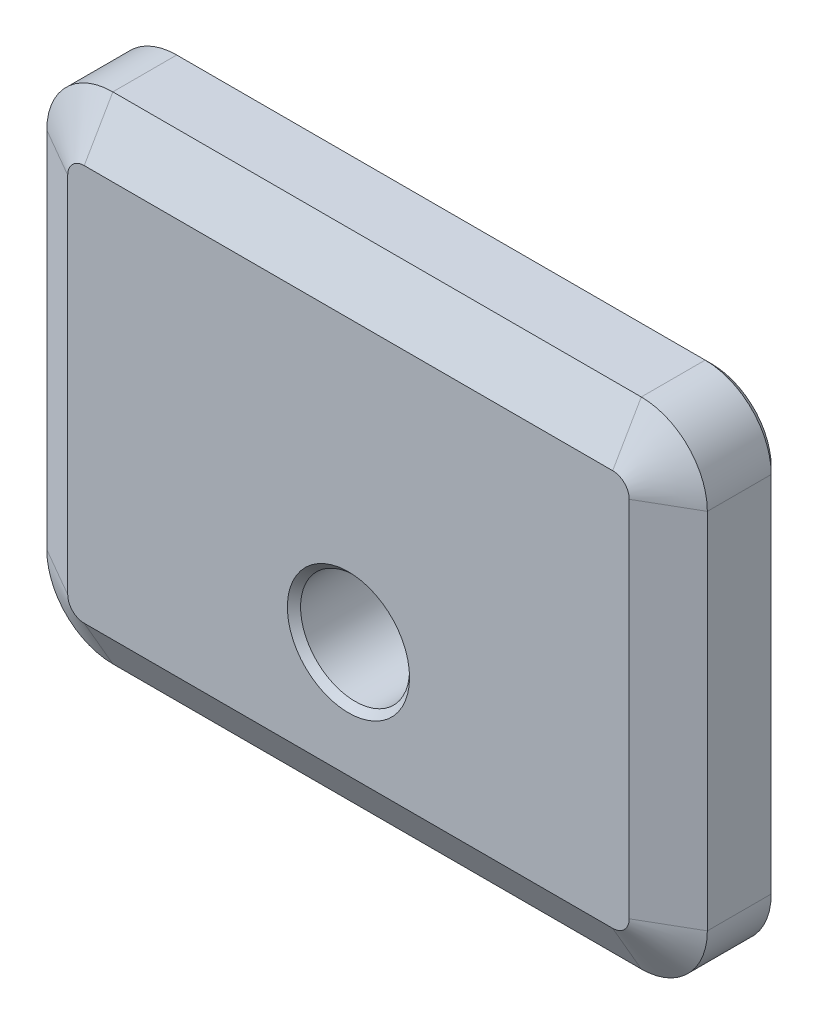
ISO-10303-21;
HEADER;
FILE_DESCRIPTION(('STEP AP214'),'2;1');
FILE_NAME('part.step','',(''),(''),'','','');
FILE_SCHEMA(('AUTOMOTIVE_DESIGN { 1 0 10303 214 1 1 1 1 }'));
ENDSEC;
DATA;
#1=APPLICATION_CONTEXT('core data for automotive mechanical design processes');
#2=APPLICATION_PROTOCOL_DEFINITION('international standard','automotive_design',2000,#1);
#3=PRODUCT_CONTEXT('',#1,'mechanical');
#4=PRODUCT('Part','Part','',(#3));
#5=PRODUCT_RELATED_PRODUCT_CATEGORY('part','',(#4));
#6=PRODUCT_DEFINITION_FORMATION('','',#4);
#7=PRODUCT_DEFINITION_CONTEXT('part definition',#1,'design');
#8=PRODUCT_DEFINITION('design','',#6,#7);
#9=PRODUCT_DEFINITION_SHAPE('','',#8);
#10=(LENGTH_UNIT() NAMED_UNIT(*) SI_UNIT(.MILLI.,.METRE.));
#11=(NAMED_UNIT(*) PLANE_ANGLE_UNIT() SI_UNIT($,.RADIAN.));
#12=(NAMED_UNIT(*) SI_UNIT($,.STERADIAN.) SOLID_ANGLE_UNIT());
#13=UNCERTAINTY_MEASURE_WITH_UNIT(LENGTH_MEASURE(1.E-05),#10,'distance_accuracy_value','');
#14=(GEOMETRIC_REPRESENTATION_CONTEXT(3) GLOBAL_UNCERTAINTY_ASSIGNED_CONTEXT((#13)) GLOBAL_UNIT_ASSIGNED_CONTEXT((#10,
#11,#12)) REPRESENTATION_CONTEXT('',''));
#15=CARTESIAN_POINT('',(0.,0.,0.));
#16=DIRECTION('',(0.,0.,1.));
#17=DIRECTION('',(1.,0.,0.));
#18=AXIS2_PLACEMENT_3D('',#15,#16,#17);
#19=CARTESIAN_POINT('',(0.,0.,3.));
#20=DIRECTION('',(0.,0.,1.));
#21=DIRECTION('',(1.,0.,0.));
#22=AXIS2_PLACEMENT_3D('',#19,#20,#21);
#23=PLANE('',#22);
#24=CARTESIAN_POINT('',(0.,0.,3.));
#25=DIRECTION('',(0.,0.,1.));
#26=DIRECTION('',(1.,0.,0.));
#27=AXIS2_PLACEMENT_3D('',#24,#25,#26);
#28=CIRCLE('',#27,1.85);
#29=CARTESIAN_POINT('',(1.85,0.,3.));
#30=VERTEX_POINT('',#29);
#31=EDGE_CURVE('E11',#30,#30,#28,.F.);
#32=ORIENTED_EDGE('',*,*,#31,.T.);
#33=EDGE_LOOP('',(#32));
#34=FACE_BOUND('',#33,.T.);
#35=CARTESIAN_POINT('',(8.,-3.,3.));
#36=DIRECTION('',(0.,0.,1.));
#37=DIRECTION('',(1.,0.,0.));
#38=AXIS2_PLACEMENT_3D('',#35,#36,#37);
#39=CIRCLE('',#38,0.5);
#40=CARTESIAN_POINT('',(8.,-3.5,3.));
#41=VERTEX_POINT('',#40);
#42=CARTESIAN_POINT('',(8.5,-3.,3.));
#43=VERTEX_POINT('',#42);
#44=EDGE_CURVE('E299',#41,#43,#39,.T.);
#45=ORIENTED_EDGE('',*,*,#44,.T.);
#46=DIRECTION('',(0.,1.,0.));
#47=VECTOR('',#46,1.);
#48=CARTESIAN_POINT('',(8.5,8.,3.));
#49=LINE('',#48,#47);
#50=CARTESIAN_POINT('',(8.5,8.,3.));
#51=VERTEX_POINT('',#50);
#52=EDGE_CURVE('E303',#43,#51,#49,.T.);
#53=ORIENTED_EDGE('',*,*,#52,.T.);
#54=CARTESIAN_POINT('',(8.,8.,3.));
#55=DIRECTION('',(0.,0.,1.));
#56=DIRECTION('',(1.,0.,0.));
#57=AXIS2_PLACEMENT_3D('',#54,#55,#56);
#58=CIRCLE('',#57,0.5);
#59=CARTESIAN_POINT('',(8.,8.5,3.));
#60=VERTEX_POINT('',#59);
#61=EDGE_CURVE('E301',#51,#60,#58,.T.);
#62=ORIENTED_EDGE('',*,*,#61,.T.);
#63=DIRECTION('',(-1.,0.,0.));
#64=VECTOR('',#63,1.);
#65=CARTESIAN_POINT('',(-8.,8.5,3.));
#66=LINE('',#65,#64);
#67=CARTESIAN_POINT('',(-8.,8.5,3.));
#68=VERTEX_POINT('',#67);
#69=EDGE_CURVE('E139',#60,#68,#66,.T.);
#70=ORIENTED_EDGE('',*,*,#69,.T.);
#71=CARTESIAN_POINT('',(-8.,8.,3.));
#72=DIRECTION('',(0.,0.,1.));
#73=DIRECTION('',(1.,0.,0.));
#74=AXIS2_PLACEMENT_3D('',#71,#72,#73);
#75=CIRCLE('',#74,0.5);
#76=CARTESIAN_POINT('',(-8.5,8.,3.));
#77=VERTEX_POINT('',#76);
#78=EDGE_CURVE('E134',#68,#77,#75,.T.);
#79=ORIENTED_EDGE('',*,*,#78,.T.);
#80=DIRECTION('',(0.,-1.,0.));
#81=VECTOR('',#80,1.);
#82=CARTESIAN_POINT('',(-8.5,-3.,3.));
#83=LINE('',#82,#81);
#84=CARTESIAN_POINT('',(-8.5,-3.,3.));
#85=VERTEX_POINT('',#84);
#86=EDGE_CURVE('E136',#77,#85,#83,.T.);
#87=ORIENTED_EDGE('',*,*,#86,.T.);
#88=CARTESIAN_POINT('',(-8.,-3.,3.));
#89=DIRECTION('',(0.,0.,1.));
#90=DIRECTION('',(1.,0.,0.));
#91=AXIS2_PLACEMENT_3D('',#88,#89,#90);
#92=CIRCLE('',#91,0.5);
#93=CARTESIAN_POINT('',(-8.,-3.5,3.));
#94=VERTEX_POINT('',#93);
#95=EDGE_CURVE('E145',#85,#94,#92,.T.);
#96=ORIENTED_EDGE('',*,*,#95,.T.);
#97=DIRECTION('',(1.,0.,0.));
#98=VECTOR('',#97,1.);
#99=CARTESIAN_POINT('',(8.,-3.5,3.));
#100=LINE('',#99,#98);
#101=EDGE_CURVE('E144',#94,#41,#100,.T.);
#102=ORIENTED_EDGE('',*,*,#101,.T.);
#103=EDGE_LOOP('',(#45,#53,#62,#70,#79,#87,#96,#102));
#104=FACE_BOUND('',#103,.T.);
#105=ADVANCED_FACE('F17',(#34,#104),#23,.T.);
#106=CARTESIAN_POINT('',(0.,0.,0.));
#107=DIRECTION('',(0.,0.,1.));
#108=DIRECTION('',(1.,0.,0.));
#109=AXIS2_PLACEMENT_3D('',#106,#107,#108);
#110=PLANE('',#109);
#111=CARTESIAN_POINT('',(0.,0.,0.));
#112=DIRECTION('',(0.,0.,1.));
#113=DIRECTION('',(1.,0.,0.));
#114=AXIS2_PLACEMENT_3D('',#111,#112,#113);
#115=CIRCLE('',#114,1.85);
#116=CARTESIAN_POINT('',(1.85,0.,0.));
#117=VERTEX_POINT('',#116);
#118=EDGE_CURVE('E188',#117,#117,#115,.T.);
#119=ORIENTED_EDGE('',*,*,#118,.T.);
#120=EDGE_LOOP('',(#119));
#121=FACE_BOUND('',#120,.T.);
#122=DIRECTION('',(0.,-1.,0.));
#123=VECTOR('',#122,1.);
#124=CARTESIAN_POINT('',(9.8,0.,0.));
#125=LINE('',#124,#123);
#126=CARTESIAN_POINT('',(9.8,8.,0.));
#127=VERTEX_POINT('',#126);
#128=CARTESIAN_POINT('',(9.8,-3.,0.));
#129=VERTEX_POINT('',#128);
#130=EDGE_CURVE('E183',#127,#129,#125,.T.);
#131=ORIENTED_EDGE('',*,*,#130,.T.);
#132=CARTESIAN_POINT('',(8.,-3.,0.));
#133=DIRECTION('',(0.,0.,1.));
#134=DIRECTION('',(1.,0.,0.));
#135=AXIS2_PLACEMENT_3D('',#132,#133,#134);
#136=CIRCLE('',#135,1.8);
#137=CARTESIAN_POINT('',(8.,-4.8,0.));
#138=VERTEX_POINT('',#137);
#139=EDGE_CURVE('E185',#129,#138,#136,.F.);
#140=ORIENTED_EDGE('',*,*,#139,.T.);
#141=DIRECTION('',(-1.,0.,0.));
#142=VECTOR('',#141,1.);
#143=CARTESIAN_POINT('',(0.,-4.8,0.));
#144=LINE('',#143,#142);
#145=CARTESIAN_POINT('',(-8.,-4.8,0.));
#146=VERTEX_POINT('',#145);
#147=EDGE_CURVE('E170',#138,#146,#144,.T.);
#148=ORIENTED_EDGE('',*,*,#147,.T.);
#149=CARTESIAN_POINT('',(-8.,-3.,0.));
#150=DIRECTION('',(0.,0.,1.));
#151=DIRECTION('',(1.,0.,0.));
#152=AXIS2_PLACEMENT_3D('',#149,#150,#151);
#153=CIRCLE('',#152,1.8);
#154=CARTESIAN_POINT('',(-9.8,-3.,0.));
#155=VERTEX_POINT('',#154);
#156=EDGE_CURVE('E172',#146,#155,#153,.F.);
#157=ORIENTED_EDGE('',*,*,#156,.T.);
#158=DIRECTION('',(0.,1.,0.));
#159=VECTOR('',#158,1.);
#160=CARTESIAN_POINT('',(-9.8,0.,0.));
#161=LINE('',#160,#159);
#162=CARTESIAN_POINT('',(-9.8,8.,0.));
#163=VERTEX_POINT('',#162);
#164=EDGE_CURVE('E175',#155,#163,#161,.T.);
#165=ORIENTED_EDGE('',*,*,#164,.T.);
#166=CARTESIAN_POINT('',(-8.,8.,0.));
#167=DIRECTION('',(0.,0.,1.));
#168=DIRECTION('',(1.,0.,0.));
#169=AXIS2_PLACEMENT_3D('',#166,#167,#168);
#170=CIRCLE('',#169,1.8);
#171=CARTESIAN_POINT('',(-8.,9.8,0.));
#172=VERTEX_POINT('',#171);
#173=EDGE_CURVE('E177',#163,#172,#170,.F.);
#174=ORIENTED_EDGE('',*,*,#173,.T.);
#175=DIRECTION('',(1.,0.,0.));
#176=VECTOR('',#175,1.);
#177=CARTESIAN_POINT('',(0.,9.8,0.));
#178=LINE('',#177,#176);
#179=CARTESIAN_POINT('',(8.,9.8,0.));
#180=VERTEX_POINT('',#179);
#181=EDGE_CURVE('E179',#172,#180,#178,.T.);
#182=ORIENTED_EDGE('',*,*,#181,.T.);
#183=CARTESIAN_POINT('',(8.,8.,0.));
#184=DIRECTION('',(0.,0.,1.));
#185=DIRECTION('',(1.,0.,0.));
#186=AXIS2_PLACEMENT_3D('',#183,#184,#185);
#187=CIRCLE('',#186,1.8);
#188=EDGE_CURVE('E181',#180,#127,#187,.F.);
#189=ORIENTED_EDGE('',*,*,#188,.T.);
#190=EDGE_LOOP('',(#131,#140,#148,#157,#165,#174,#182,#189));
#191=FACE_BOUND('',#190,.T.);
#192=ADVANCED_FACE('F351',(#121,#191),#110,.F.);
#193=CARTESIAN_POINT('',(-10.,10.,3.));
#194=DIRECTION('',(1.,0.,0.));
#195=DIRECTION('',(0.,0.,-1.));
#196=AXIS2_PLACEMENT_3D('',#193,#194,#195);
#197=PLANE('',#196);
#198=DIRECTION('',(0.,0.,-1.));
#199=VECTOR('',#198,1.);
#200=CARTESIAN_POINT('',(-10.,8.,3.));
#201=LINE('',#200,#199);
#202=CARTESIAN_POINT('',(-10.,8.,2.13397459621557));
#203=VERTEX_POINT('',#202);
#204=CARTESIAN_POINT('',(-10.,8.,0.2));
#205=VERTEX_POINT('',#204);
#206=EDGE_CURVE('E276',#203,#205,#201,.T.);
#207=ORIENTED_EDGE('',*,*,#206,.T.);
#208=DIRECTION('',(0.,-1.,0.));
#209=VECTOR('',#208,1.);
#210=CARTESIAN_POINT('',(-10.,10.,0.2));
#211=LINE('',#210,#209);
#212=CARTESIAN_POINT('',(-10.,-3.,0.2));
#213=VERTEX_POINT('',#212);
#214=EDGE_CURVE('E43',#205,#213,#211,.T.);
#215=ORIENTED_EDGE('',*,*,#214,.T.);
#216=DIRECTION('',(0.,0.,-1.));
#217=VECTOR('',#216,1.);
#218=CARTESIAN_POINT('',(-10.,-3.,3.));
#219=LINE('',#218,#217);
#220=CARTESIAN_POINT('',(-10.,-3.,2.13397459621557));
#221=VERTEX_POINT('',#220);
#222=EDGE_CURVE('E277',#213,#221,#219,.F.);
#223=ORIENTED_EDGE('',*,*,#222,.T.);
#224=DIRECTION('',(0.,1.,0.));
#225=VECTOR('',#224,1.);
#226=CARTESIAN_POINT('',(-10.,8.,2.13397459621557));
#227=LINE('',#226,#225);
#228=EDGE_CURVE('E173',#221,#203,#227,.T.);
#229=ORIENTED_EDGE('',*,*,#228,.T.);
#230=EDGE_LOOP('',(#207,#215,#223,#229));
#231=FACE_BOUND('',#230,.T.);
#232=ADVANCED_FACE('F275',(#231),#197,.F.);
#233=CARTESIAN_POINT('',(-10.,-5.,3.));
#234=DIRECTION('',(0.,1.,0.));
#235=DIRECTION('',(-1.,0.,0.));
#236=AXIS2_PLACEMENT_3D('',#233,#234,#235);
#237=PLANE('',#236);
#238=DIRECTION('',(0.,0.,-1.));
#239=VECTOR('',#238,1.);
#240=CARTESIAN_POINT('',(-8.,-5.,3.));
#241=LINE('',#240,#239);
#242=CARTESIAN_POINT('',(-8.,-5.,2.13397459621557));
#243=VERTEX_POINT('',#242);
#244=CARTESIAN_POINT('',(-8.,-5.,0.2));
#245=VERTEX_POINT('',#244);
#246=EDGE_CURVE('E282',#243,#245,#241,.T.);
#247=ORIENTED_EDGE('',*,*,#246,.T.);
#248=DIRECTION('',(1.,0.,0.));
#249=VECTOR('',#248,1.);
#250=CARTESIAN_POINT('',(-10.,-5.,0.2));
#251=LINE('',#250,#249);
#252=CARTESIAN_POINT('',(8.,-5.,0.2));
#253=VERTEX_POINT('',#252);
#254=EDGE_CURVE('E27',#245,#253,#251,.T.);
#255=ORIENTED_EDGE('',*,*,#254,.T.);
#256=DIRECTION('',(0.,0.,-1.));
#257=VECTOR('',#256,1.);
#258=CARTESIAN_POINT('',(8.,-5.,3.));
#259=LINE('',#258,#257);
#260=CARTESIAN_POINT('',(8.,-5.,2.13397459621557));
#261=VERTEX_POINT('',#260);
#262=EDGE_CURVE('E163',#253,#261,#259,.F.);
#263=ORIENTED_EDGE('',*,*,#262,.T.);
#264=DIRECTION('',(-1.,0.,0.));
#265=VECTOR('',#264,1.);
#266=CARTESIAN_POINT('',(-8.,-5.,2.13397459621557));
#267=LINE('',#266,#265);
#268=EDGE_CURVE('E262',#261,#243,#267,.T.);
#269=ORIENTED_EDGE('',*,*,#268,.T.);
#270=EDGE_LOOP('',(#247,#255,#263,#269));
#271=FACE_BOUND('',#270,.T.);
#272=ADVANCED_FACE('F334',(#271),#237,.F.);
#273=CARTESIAN_POINT('',(10.,10.,3.));
#274=DIRECTION('',(-1.,0.,0.));
#275=DIRECTION('',(0.,-1.,0.));
#276=AXIS2_PLACEMENT_3D('',#273,#274,#275);
#277=PLANE('',#276);
#278=DIRECTION('',(0.,0.,-1.));
#279=VECTOR('',#278,1.);
#280=CARTESIAN_POINT('',(10.,-3.,3.));
#281=LINE('',#280,#279);
#282=CARTESIAN_POINT('',(10.,-3.,2.13397459621557));
#283=VERTEX_POINT('',#282);
#284=CARTESIAN_POINT('',(10.,-3.,0.2));
#285=VERTEX_POINT('',#284);
#286=EDGE_CURVE('E290',#283,#285,#281,.T.);
#287=ORIENTED_EDGE('',*,*,#286,.T.);
#288=DIRECTION('',(0.,1.,0.));
#289=VECTOR('',#288,1.);
#290=CARTESIAN_POINT('',(10.,10.,0.2));
#291=LINE('',#290,#289);
#292=CARTESIAN_POINT('',(10.,8.,0.2));
#293=VERTEX_POINT('',#292);
#294=EDGE_CURVE('E200',#285,#293,#291,.T.);
#295=ORIENTED_EDGE('',*,*,#294,.T.);
#296=DIRECTION('',(0.,0.,-1.));
#297=VECTOR('',#296,1.);
#298=CARTESIAN_POINT('',(10.,8.,3.));
#299=LINE('',#298,#297);
#300=CARTESIAN_POINT('',(10.,8.,2.13397459621557));
#301=VERTEX_POINT('',#300);
#302=EDGE_CURVE('E284',#293,#301,#299,.F.);
#303=ORIENTED_EDGE('',*,*,#302,.T.);
#304=DIRECTION('',(0.,-1.,0.));
#305=VECTOR('',#304,1.);
#306=CARTESIAN_POINT('',(10.,-3.,2.13397459621557));
#307=LINE('',#306,#305);
#308=EDGE_CURVE('E306',#301,#283,#307,.T.);
#309=ORIENTED_EDGE('',*,*,#308,.T.);
#310=EDGE_LOOP('',(#287,#295,#303,#309));
#311=FACE_BOUND('',#310,.T.);
#312=ADVANCED_FACE('F366',(#311),#277,.F.);
#313=CARTESIAN_POINT('',(-10.,10.,3.));
#314=DIRECTION('',(0.,-1.,0.));
#315=DIRECTION('',(1.,0.,0.));
#316=AXIS2_PLACEMENT_3D('',#313,#314,#315);
#317=PLANE('',#316);
#318=DIRECTION('',(0.,0.,-1.));
#319=VECTOR('',#318,1.);
#320=CARTESIAN_POINT('',(8.,10.,3.));
#321=LINE('',#320,#319);
#322=CARTESIAN_POINT('',(8.,10.,2.13397459621557));
#323=VERTEX_POINT('',#322);
#324=CARTESIAN_POINT('',(8.,10.,0.2));
#325=VERTEX_POINT('',#324);
#326=EDGE_CURVE('E293',#323,#325,#321,.T.);
#327=ORIENTED_EDGE('',*,*,#326,.T.);
#328=DIRECTION('',(-1.,0.,0.));
#329=VECTOR('',#328,1.);
#330=CARTESIAN_POINT('',(-10.,10.,0.2));
#331=LINE('',#330,#329);
#332=CARTESIAN_POINT('',(-8.,10.,0.2));
#333=VERTEX_POINT('',#332);
#334=EDGE_CURVE('E204',#325,#333,#331,.T.);
#335=ORIENTED_EDGE('',*,*,#334,.T.);
#336=DIRECTION('',(0.,0.,-1.));
#337=VECTOR('',#336,1.);
#338=CARTESIAN_POINT('',(-8.,10.,3.));
#339=LINE('',#338,#337);
#340=CARTESIAN_POINT('',(-8.,10.,2.13397459621557));
#341=VERTEX_POINT('',#340);
#342=EDGE_CURVE('E156',#333,#341,#339,.F.);
#343=ORIENTED_EDGE('',*,*,#342,.T.);
#344=DIRECTION('',(1.,0.,0.));
#345=VECTOR('',#344,1.);
#346=CARTESIAN_POINT('',(8.,10.,2.13397459621557));
#347=LINE('',#346,#345);
#348=EDGE_CURVE('E257',#341,#323,#347,.T.);
#349=ORIENTED_EDGE('',*,*,#348,.T.);
#350=EDGE_LOOP('',(#327,#335,#343,#349));
#351=FACE_BOUND('',#350,.T.);
#352=ADVANCED_FACE('F363',(#351),#317,.F.);
#353=CARTESIAN_POINT('',(0.,0.,3.));
#354=DIRECTION('',(0.,0.,-1.));
#355=DIRECTION('',(-1.,0.,0.));
#356=AXIS2_PLACEMENT_3D('',#353,#354,#355);
#357=CYLINDRICAL_SURFACE('',#356,1.65);
#358=CARTESIAN_POINT('',(0.,0.,0.200000000000003));
#359=DIRECTION('',(0.,0.,1.));
#360=DIRECTION('',(1.,0.,0.));
#361=AXIS2_PLACEMENT_3D('',#358,#359,#360);
#362=CIRCLE('',#361,1.65);
#363=CARTESIAN_POINT('',(1.65,0.,0.200000000000003));
#364=VERTEX_POINT('',#363);
#365=EDGE_CURVE('E194',#364,#364,#362,.F.);
#366=ORIENTED_EDGE('',*,*,#365,.T.);
#367=EDGE_LOOP('',(#366));
#368=FACE_BOUND('',#367,.T.);
#369=CARTESIAN_POINT('',(0.,0.,2.8));
#370=DIRECTION('',(0.,0.,1.));
#371=DIRECTION('',(1.,0.,0.));
#372=AXIS2_PLACEMENT_3D('',#369,#370,#371);
#373=CIRCLE('',#372,1.65);
#374=CARTESIAN_POINT('',(1.65,0.,2.8));
#375=VERTEX_POINT('',#374);
#376=EDGE_CURVE('E191',#375,#375,#373,.T.);
#377=ORIENTED_EDGE('',*,*,#376,.T.);
#378=EDGE_LOOP('',(#377));
#379=FACE_BOUND('',#378,.T.);
#380=ADVANCED_FACE('F361',(#368,#379),#357,.F.);
#381=CARTESIAN_POINT('',(-8.,-3.,3.));
#382=DIRECTION('',(0.,0.,-1.));
#383=DIRECTION('',(-1.,0.,0.));
#384=AXIS2_PLACEMENT_3D('',#381,#382,#383);
#385=CYLINDRICAL_SURFACE('',#384,2.);
#386=ORIENTED_EDGE('',*,*,#222,.F.);
#387=CARTESIAN_POINT('',(-8.,-3.,0.2));
#388=DIRECTION('',(0.,0.,1.));
#389=DIRECTION('',(1.,0.,0.));
#390=AXIS2_PLACEMENT_3D('',#387,#388,#389);
#391=CIRCLE('',#390,2.);
#392=EDGE_CURVE('E35',#213,#245,#391,.T.);
#393=ORIENTED_EDGE('',*,*,#392,.T.);
#394=ORIENTED_EDGE('',*,*,#246,.F.);
#395=CARTESIAN_POINT('',(-8.,-3.,2.13397459621557));
#396=DIRECTION('',(0.,0.,1.));
#397=DIRECTION('',(1.,0.,0.));
#398=AXIS2_PLACEMENT_3D('',#395,#396,#397);
#399=CIRCLE('',#398,2.);
#400=EDGE_CURVE('E271',#243,#221,#399,.F.);
#401=ORIENTED_EDGE('',*,*,#400,.T.);
#402=EDGE_LOOP('',(#386,#393,#394,#401));
#403=FACE_BOUND('',#402,.T.);
#404=ADVANCED_FACE('F336',(#403),#385,.T.);
#405=CARTESIAN_POINT('',(8.,-3.,3.));
#406=DIRECTION('',(0.,0.,-1.));
#407=DIRECTION('',(-1.,0.,0.));
#408=AXIS2_PLACEMENT_3D('',#405,#406,#407);
#409=CYLINDRICAL_SURFACE('',#408,2.);
#410=ORIENTED_EDGE('',*,*,#262,.F.);
#411=CARTESIAN_POINT('',(8.,-3.,0.2));
#412=DIRECTION('',(0.,0.,1.));
#413=DIRECTION('',(1.,0.,0.));
#414=AXIS2_PLACEMENT_3D('',#411,#412,#413);
#415=CIRCLE('',#414,2.);
#416=EDGE_CURVE('E197',#253,#285,#415,.T.);
#417=ORIENTED_EDGE('',*,*,#416,.T.);
#418=ORIENTED_EDGE('',*,*,#286,.F.);
#419=CARTESIAN_POINT('',(8.,-3.,2.13397459621557));
#420=DIRECTION('',(0.,0.,1.));
#421=DIRECTION('',(1.,0.,0.));
#422=AXIS2_PLACEMENT_3D('',#419,#420,#421);
#423=CIRCLE('',#422,2.);
#424=EDGE_CURVE('E263',#283,#261,#423,.F.);
#425=ORIENTED_EDGE('',*,*,#424,.T.);
#426=EDGE_LOOP('',(#410,#417,#418,#425));
#427=FACE_BOUND('',#426,.T.);
#428=ADVANCED_FACE('F328',(#427),#409,.T.);
#429=CARTESIAN_POINT('',(-8.,8.,3.));
#430=DIRECTION('',(0.,0.,-1.));
#431=DIRECTION('',(-1.,0.,0.));
#432=AXIS2_PLACEMENT_3D('',#429,#430,#431);
#433=CYLINDRICAL_SURFACE('',#432,2.);
#434=ORIENTED_EDGE('',*,*,#342,.F.);
#435=CARTESIAN_POINT('',(-8.,8.,0.2));
#436=DIRECTION('',(0.,0.,1.));
#437=DIRECTION('',(1.,0.,0.));
#438=AXIS2_PLACEMENT_3D('',#435,#436,#437);
#439=CIRCLE('',#438,2.);
#440=EDGE_CURVE('E206',#333,#205,#439,.T.);
#441=ORIENTED_EDGE('',*,*,#440,.T.);
#442=ORIENTED_EDGE('',*,*,#206,.F.);
#443=CARTESIAN_POINT('',(-8.,8.,2.13397459621557));
#444=DIRECTION('',(0.,0.,1.));
#445=DIRECTION('',(1.,0.,0.));
#446=AXIS2_PLACEMENT_3D('',#443,#444,#445);
#447=CIRCLE('',#446,2.);
#448=EDGE_CURVE('E160',#203,#341,#447,.F.);
#449=ORIENTED_EDGE('',*,*,#448,.T.);
#450=EDGE_LOOP('',(#434,#441,#442,#449));
#451=FACE_BOUND('',#450,.T.);
#452=ADVANCED_FACE('F280',(#451),#433,.T.);
#453=CARTESIAN_POINT('',(8.,8.,3.));
#454=DIRECTION('',(0.,0.,-1.));
#455=DIRECTION('',(-1.,0.,0.));
#456=AXIS2_PLACEMENT_3D('',#453,#454,#455);
#457=CYLINDRICAL_SURFACE('',#456,2.);
#458=ORIENTED_EDGE('',*,*,#302,.F.);
#459=CARTESIAN_POINT('',(8.,8.,0.2));
#460=DIRECTION('',(0.,0.,1.));
#461=DIRECTION('',(1.,0.,0.));
#462=AXIS2_PLACEMENT_3D('',#459,#460,#461);
#463=CIRCLE('',#462,2.);
#464=EDGE_CURVE('E202',#293,#325,#463,.T.);
#465=ORIENTED_EDGE('',*,*,#464,.T.);
#466=ORIENTED_EDGE('',*,*,#326,.F.);
#467=CARTESIAN_POINT('',(8.,8.,2.13397459621557));
#468=DIRECTION('',(0.,0.,1.));
#469=DIRECTION('',(1.,0.,0.));
#470=AXIS2_PLACEMENT_3D('',#467,#468,#469);
#471=CIRCLE('',#470,2.);
#472=EDGE_CURVE('E267',#323,#301,#471,.F.);
#473=ORIENTED_EDGE('',*,*,#472,.T.);
#474=EDGE_LOOP('',(#458,#465,#466,#473));
#475=FACE_BOUND('',#474,.T.);
#476=ADVANCED_FACE('F311',(#475),#457,.T.);
#477=CARTESIAN_POINT('',(-8.5,0.,3.));
#478=DIRECTION('',(-0.5,0.,0.86602540378444));
#479=DIRECTION('',(0.,1.,0.));
#480=AXIS2_PLACEMENT_3D('',#477,#478,#479);
#481=PLANE('',#480);
#482=DIRECTION('',(0.86602540378444,0.,0.5));
#483=VECTOR('',#482,1.);
#484=CARTESIAN_POINT('',(-10.,8.,2.13397459621557));
#485=LINE('',#484,#483);
#486=EDGE_CURVE('E151',#203,#77,#485,.T.);
#487=ORIENTED_EDGE('',*,*,#486,.F.);
#488=ORIENTED_EDGE('',*,*,#228,.F.);
#489=DIRECTION('',(-0.86602540378444,0.,-0.5));
#490=VECTOR('',#489,1.);
#491=CARTESIAN_POINT('',(-8.5,-3.,3.));
#492=LINE('',#491,#490);
#493=EDGE_CURVE('E154',#85,#221,#492,.T.);
#494=ORIENTED_EDGE('',*,*,#493,.F.);
#495=ORIENTED_EDGE('',*,*,#86,.F.);
#496=EDGE_LOOP('',(#487,#488,#494,#495));
#497=FACE_BOUND('',#496,.T.);
#498=ADVANCED_FACE('F149',(#497),#481,.T.);
#499=CARTESIAN_POINT('',(-8.,-3.,3.));
#500=DIRECTION('',(0.,0.,-1.));
#501=DIRECTION('',(-1.,0.,0.));
#502=AXIS2_PLACEMENT_3D('',#499,#500,#501);
#503=CONICAL_SURFACE('',#502,0.5,1.0471975511966);
#504=ORIENTED_EDGE('',*,*,#493,.T.);
#505=ORIENTED_EDGE('',*,*,#400,.F.);
#506=DIRECTION('',(0.,-0.86602540378444,-0.5));
#507=VECTOR('',#506,1.);
#508=CARTESIAN_POINT('',(-8.,-3.5,3.));
#509=LINE('',#508,#507);
#510=EDGE_CURVE('E161',#94,#243,#509,.T.);
#511=ORIENTED_EDGE('',*,*,#510,.F.);
#512=ORIENTED_EDGE('',*,*,#95,.F.);
#513=EDGE_LOOP('',(#504,#505,#511,#512));
#514=FACE_BOUND('',#513,.T.);
#515=ADVANCED_FACE('F338',(#514),#503,.T.);
#516=CARTESIAN_POINT('',(-8.,8.,3.));
#517=DIRECTION('',(0.,0.,-1.));
#518=DIRECTION('',(-1.,0.,0.));
#519=AXIS2_PLACEMENT_3D('',#516,#517,#518);
#520=CONICAL_SURFACE('',#519,0.5,1.0471975511966);
#521=ORIENTED_EDGE('',*,*,#486,.T.);
#522=ORIENTED_EDGE('',*,*,#78,.F.);
#523=DIRECTION('',(0.,-0.86602540378444,0.5));
#524=VECTOR('',#523,1.);
#525=CARTESIAN_POINT('',(-8.,10.,2.13397459621557));
#526=LINE('',#525,#524);
#527=EDGE_CURVE('E166',#341,#68,#526,.T.);
#528=ORIENTED_EDGE('',*,*,#527,.F.);
#529=ORIENTED_EDGE('',*,*,#448,.F.);
#530=EDGE_LOOP('',(#521,#522,#528,#529));
#531=FACE_BOUND('',#530,.T.);
#532=ADVANCED_FACE('F158',(#531),#520,.T.);
#533=CARTESIAN_POINT('',(0.,-3.5,3.));
#534=DIRECTION('',(0.,-0.5,0.86602540378444));
#535=DIRECTION('',(-1.,0.,0.));
#536=AXIS2_PLACEMENT_3D('',#533,#534,#535);
#537=PLANE('',#536);
#538=ORIENTED_EDGE('',*,*,#510,.T.);
#539=ORIENTED_EDGE('',*,*,#268,.F.);
#540=DIRECTION('',(0.,-0.86602540378444,-0.5));
#541=VECTOR('',#540,1.);
#542=CARTESIAN_POINT('',(8.,-3.5,3.));
#543=LINE('',#542,#541);
#544=EDGE_CURVE('E251',#41,#261,#543,.T.);
#545=ORIENTED_EDGE('',*,*,#544,.F.);
#546=ORIENTED_EDGE('',*,*,#101,.F.);
#547=EDGE_LOOP('',(#538,#539,#545,#546));
#548=FACE_BOUND('',#547,.T.);
#549=ADVANCED_FACE('F331',(#548),#537,.T.);
#550=CARTESIAN_POINT('',(0.,8.5,3.));
#551=DIRECTION('',(0.,0.5,0.86602540378444));
#552=DIRECTION('',(1.,0.,0.));
#553=AXIS2_PLACEMENT_3D('',#550,#551,#552);
#554=PLANE('',#553);
#555=ORIENTED_EDGE('',*,*,#527,.T.);
#556=ORIENTED_EDGE('',*,*,#69,.F.);
#557=DIRECTION('',(0.,-0.866025403784439,0.5));
#558=VECTOR('',#557,1.);
#559=CARTESIAN_POINT('',(8.,10.,2.13397459621557));
#560=LINE('',#559,#558);
#561=EDGE_CURVE('E244',#323,#60,#560,.T.);
#562=ORIENTED_EDGE('',*,*,#561,.F.);
#563=ORIENTED_EDGE('',*,*,#348,.F.);
#564=EDGE_LOOP('',(#555,#556,#562,#563));
#565=FACE_BOUND('',#564,.T.);
#566=ADVANCED_FACE('F255',(#565),#554,.T.);
#567=CARTESIAN_POINT('',(8.,-3.,3.));
#568=DIRECTION('',(0.,0.,-1.));
#569=DIRECTION('',(-1.,0.,0.));
#570=AXIS2_PLACEMENT_3D('',#567,#568,#569);
#571=CONICAL_SURFACE('',#570,0.5,1.0471975511966);
#572=ORIENTED_EDGE('',*,*,#544,.T.);
#573=ORIENTED_EDGE('',*,*,#424,.F.);
#574=DIRECTION('',(0.86602540378444,0.,-0.5));
#575=VECTOR('',#574,1.);
#576=CARTESIAN_POINT('',(8.5,-3.,3.));
#577=LINE('',#576,#575);
#578=EDGE_CURVE('E237',#43,#283,#577,.T.);
#579=ORIENTED_EDGE('',*,*,#578,.F.);
#580=ORIENTED_EDGE('',*,*,#44,.F.);
#581=EDGE_LOOP('',(#572,#573,#579,#580));
#582=FACE_BOUND('',#581,.T.);
#583=ADVANCED_FACE('F324',(#582),#571,.T.);
#584=CARTESIAN_POINT('',(8.,8.,3.));
#585=DIRECTION('',(0.,0.,-1.));
#586=DIRECTION('',(-1.,0.,0.));
#587=AXIS2_PLACEMENT_3D('',#584,#585,#586);
#588=CONICAL_SURFACE('',#587,0.5,1.0471975511966);
#589=ORIENTED_EDGE('',*,*,#561,.T.);
#590=ORIENTED_EDGE('',*,*,#61,.F.);
#591=DIRECTION('',(-0.86602540378444,0.,0.5));
#592=VECTOR('',#591,1.);
#593=CARTESIAN_POINT('',(10.,8.,2.13397459621557));
#594=LINE('',#593,#592);
#595=EDGE_CURVE('E232',#301,#51,#594,.T.);
#596=ORIENTED_EDGE('',*,*,#595,.F.);
#597=ORIENTED_EDGE('',*,*,#472,.F.);
#598=EDGE_LOOP('',(#589,#590,#596,#597));
#599=FACE_BOUND('',#598,.T.);
#600=ADVANCED_FACE('F319',(#599),#588,.T.);
#601=CARTESIAN_POINT('',(8.5,0.,3.));
#602=DIRECTION('',(0.5,0.,0.86602540378444));
#603=DIRECTION('',(0.,-1.,0.));
#604=AXIS2_PLACEMENT_3D('',#601,#602,#603);
#605=PLANE('',#604);
#606=ORIENTED_EDGE('',*,*,#578,.T.);
#607=ORIENTED_EDGE('',*,*,#308,.F.);
#608=ORIENTED_EDGE('',*,*,#595,.T.);
#609=ORIENTED_EDGE('',*,*,#52,.F.);
#610=EDGE_LOOP('',(#606,#607,#608,#609));
#611=FACE_BOUND('',#610,.T.);
#612=ADVANCED_FACE('F314',(#611),#605,.T.);
#613=CARTESIAN_POINT('',(0.,0.,0.));
#614=DIRECTION('',(0.,0.,-1.));
#615=DIRECTION('',(-1.,0.,0.));
#616=AXIS2_PLACEMENT_3D('',#613,#614,#615);
#617=CONICAL_SURFACE('',#616,1.85,0.785398163397452);
#618=ORIENTED_EDGE('',*,*,#365,.F.);
#619=EDGE_LOOP('',(#618));
#620=FACE_BOUND('',#619,.T.);
#621=ORIENTED_EDGE('',*,*,#118,.F.);
#622=EDGE_LOOP('',(#621));
#623=FACE_BOUND('',#622,.T.);
#624=ADVANCED_FACE('F389',(#620,#623),#617,.F.);
#625=CARTESIAN_POINT('',(-8.,8.,0.));
#626=DIRECTION('',(0.,0.,1.));
#627=DIRECTION('',(1.,0.,0.));
#628=AXIS2_PLACEMENT_3D('',#625,#626,#627);
#629=CONICAL_SURFACE('',#628,1.8,0.785398163397448);
#630=DIRECTION('',(0.707106781186548,0.,-0.707106781186548));
#631=VECTOR('',#630,1.);
#632=CARTESIAN_POINT('',(-10.,8.,0.2));
#633=LINE('',#632,#631);
#634=EDGE_CURVE('E226',#205,#163,#633,.T.);
#635=ORIENTED_EDGE('',*,*,#634,.F.);
#636=ORIENTED_EDGE('',*,*,#440,.F.);
#637=DIRECTION('',(0.,0.707106781186548,0.707106781186548));
#638=VECTOR('',#637,1.);
#639=CARTESIAN_POINT('',(-8.,9.8,0.));
#640=LINE('',#639,#638);
#641=EDGE_CURVE('E22',#172,#333,#640,.T.);
#642=ORIENTED_EDGE('',*,*,#641,.F.);
#643=ORIENTED_EDGE('',*,*,#173,.F.);
#644=EDGE_LOOP('',(#635,#636,#642,#643));
#645=FACE_BOUND('',#644,.T.);
#646=ADVANCED_FACE('F424',(#645),#629,.T.);
#647=CARTESIAN_POINT('',(-10.,10.,0.2));
#648=DIRECTION('',(0.,-0.707106781186549,0.707106781186546));
#649=DIRECTION('',(-1.,0.,0.));
#650=AXIS2_PLACEMENT_3D('',#647,#648,#649);
#651=PLANE('',#650);
#652=ORIENTED_EDGE('',*,*,#641,.T.);
#653=ORIENTED_EDGE('',*,*,#334,.F.);
#654=DIRECTION('',(0.,0.707106781186548,0.707106781186548));
#655=VECTOR('',#654,1.);
#656=CARTESIAN_POINT('',(8.,9.8,0.));
#657=LINE('',#656,#655);
#658=EDGE_CURVE('E224',#180,#325,#657,.T.);
#659=ORIENTED_EDGE('',*,*,#658,.F.);
#660=ORIENTED_EDGE('',*,*,#181,.F.);
#661=EDGE_LOOP('',(#652,#653,#659,#660));
#662=FACE_BOUND('',#661,.T.);
#663=ADVANCED_FACE('F468',(#662),#651,.F.);
#664=CARTESIAN_POINT('',(-10.,10.,0.2));
#665=DIRECTION('',(0.707106781186548,0.,0.707106781186548));
#666=DIRECTION('',(0.,-1.,0.));
#667=AXIS2_PLACEMENT_3D('',#664,#665,#666);
#668=PLANE('',#667);
#669=ORIENTED_EDGE('',*,*,#634,.T.);
#670=ORIENTED_EDGE('',*,*,#164,.F.);
#671=DIRECTION('',(0.707106781186548,0.,-0.707106781186548));
#672=VECTOR('',#671,1.);
#673=CARTESIAN_POINT('',(-10.,-3.,0.2));
#674=LINE('',#673,#672);
#675=EDGE_CURVE('E221',#213,#155,#674,.T.);
#676=ORIENTED_EDGE('',*,*,#675,.F.);
#677=ORIENTED_EDGE('',*,*,#214,.F.);
#678=EDGE_LOOP('',(#669,#670,#676,#677));
#679=FACE_BOUND('',#678,.T.);
#680=ADVANCED_FACE('F461',(#679),#668,.F.);
#681=CARTESIAN_POINT('',(8.,8.,0.));
#682=DIRECTION('',(0.,0.,1.));
#683=DIRECTION('',(1.,0.,0.));
#684=AXIS2_PLACEMENT_3D('',#681,#682,#683);
#685=CONICAL_SURFACE('',#684,1.8,0.785398163397448);
#686=ORIENTED_EDGE('',*,*,#658,.T.);
#687=ORIENTED_EDGE('',*,*,#464,.F.);
#688=DIRECTION('',(0.707106781186548,0.,0.707106781186548));
#689=VECTOR('',#688,1.);
#690=CARTESIAN_POINT('',(9.8,8.,0.));
#691=LINE('',#690,#689);
#692=EDGE_CURVE('E218',#127,#293,#691,.T.);
#693=ORIENTED_EDGE('',*,*,#692,.F.);
#694=ORIENTED_EDGE('',*,*,#188,.F.);
#695=EDGE_LOOP('',(#686,#687,#693,#694));
#696=FACE_BOUND('',#695,.T.);
#697=ADVANCED_FACE('F454',(#696),#685,.T.);
#698=CARTESIAN_POINT('',(-8.,-3.,0.));
#699=DIRECTION('',(0.,0.,1.));
#700=DIRECTION('',(1.,0.,0.));
#701=AXIS2_PLACEMENT_3D('',#698,#699,#700);
#702=CONICAL_SURFACE('',#701,1.8,0.785398163397448);
#703=ORIENTED_EDGE('',*,*,#675,.T.);
#704=ORIENTED_EDGE('',*,*,#156,.F.);
#705=DIRECTION('',(0.,0.707106781186546,-0.707106781186549));
#706=VECTOR('',#705,1.);
#707=CARTESIAN_POINT('',(-8.,-5.,0.2));
#708=LINE('',#707,#706);
#709=EDGE_CURVE('E215',#245,#146,#708,.T.);
#710=ORIENTED_EDGE('',*,*,#709,.F.);
#711=ORIENTED_EDGE('',*,*,#392,.F.);
#712=EDGE_LOOP('',(#703,#704,#710,#711));
#713=FACE_BOUND('',#712,.T.);
#714=ADVANCED_FACE('F447',(#713),#702,.T.);
#715=CARTESIAN_POINT('',(10.,10.,0.2));
#716=DIRECTION('',(-0.707106781186547,0.,0.707106781186549));
#717=DIRECTION('',(0.,1.,0.));
#718=AXIS2_PLACEMENT_3D('',#715,#716,#717);
#719=PLANE('',#718);
#720=ORIENTED_EDGE('',*,*,#692,.T.);
#721=ORIENTED_EDGE('',*,*,#294,.F.);
#722=DIRECTION('',(0.707106781186551,0.,0.707106781186545));
#723=VECTOR('',#722,1.);
#724=CARTESIAN_POINT('',(9.8,-3.,0.));
#725=LINE('',#724,#723);
#726=EDGE_CURVE('E213',#129,#285,#725,.T.);
#727=ORIENTED_EDGE('',*,*,#726,.F.);
#728=ORIENTED_EDGE('',*,*,#130,.F.);
#729=EDGE_LOOP('',(#720,#721,#727,#728));
#730=FACE_BOUND('',#729,.T.);
#731=ADVANCED_FACE('F440',(#730),#719,.F.);
#732=CARTESIAN_POINT('',(-10.,-5.,0.2));
#733=DIRECTION('',(0.,0.707106781186548,0.707106781186547));
#734=DIRECTION('',(1.,0.,0.));
#735=AXIS2_PLACEMENT_3D('',#732,#733,#734);
#736=PLANE('',#735);
#737=ORIENTED_EDGE('',*,*,#709,.T.);
#738=ORIENTED_EDGE('',*,*,#147,.F.);
#739=DIRECTION('',(0.,0.707106781186546,-0.707106781186549));
#740=VECTOR('',#739,1.);
#741=CARTESIAN_POINT('',(8.,-5.,0.2));
#742=LINE('',#741,#740);
#743=EDGE_CURVE('E211',#253,#138,#742,.T.);
#744=ORIENTED_EDGE('',*,*,#743,.F.);
#745=ORIENTED_EDGE('',*,*,#254,.F.);
#746=EDGE_LOOP('',(#737,#738,#744,#745));
#747=FACE_BOUND('',#746,.T.);
#748=ADVANCED_FACE('F433',(#747),#736,.F.);
#749=CARTESIAN_POINT('',(8.,-3.,0.));
#750=DIRECTION('',(0.,0.,1.));
#751=DIRECTION('',(1.,0.,0.));
#752=AXIS2_PLACEMENT_3D('',#749,#750,#751);
#753=CONICAL_SURFACE('',#752,1.8,0.785398163397448);
#754=ORIENTED_EDGE('',*,*,#726,.T.);
#755=ORIENTED_EDGE('',*,*,#416,.F.);
#756=ORIENTED_EDGE('',*,*,#743,.T.);
#757=ORIENTED_EDGE('',*,*,#139,.F.);
#758=EDGE_LOOP('',(#754,#755,#756,#757));
#759=FACE_BOUND('',#758,.T.);
#760=ADVANCED_FACE('F427',(#759),#753,.T.);
#761=CARTESIAN_POINT('',(0.,0.,2.8));
#762=DIRECTION('',(0.,0.,1.));
#763=DIRECTION('',(1.,0.,0.));
#764=AXIS2_PLACEMENT_3D('',#761,#762,#763);
#765=CONICAL_SURFACE('',#764,1.65,0.785398163397462);
#766=ORIENTED_EDGE('',*,*,#31,.F.);
#767=EDGE_LOOP('',(#766));
#768=FACE_BOUND('',#767,.T.);
#769=ORIENTED_EDGE('',*,*,#376,.F.);
#770=EDGE_LOOP('',(#769));
#771=FACE_BOUND('',#770,.T.);
#772=ADVANCED_FACE('F20',(#768,#771),#765,.F.);
#773=CLOSED_SHELL('',(#105,#192,#232,#272,#312,#352,#380,#404,#428,#452,#476,#498,#515,#532,
#549,#566,#583,#600,#612,#624,#646,#663,#680,#697,#714,#731,#748,#760,#772));
#774=MANIFOLD_SOLID_BREP('B1',#773);
#775=ADVANCED_BREP_SHAPE_REPRESENTATION('',(#18,#774),#14);
#776=SHAPE_DEFINITION_REPRESENTATION(#9,#775);
ENDSEC;
END-ISO-10303-21;
